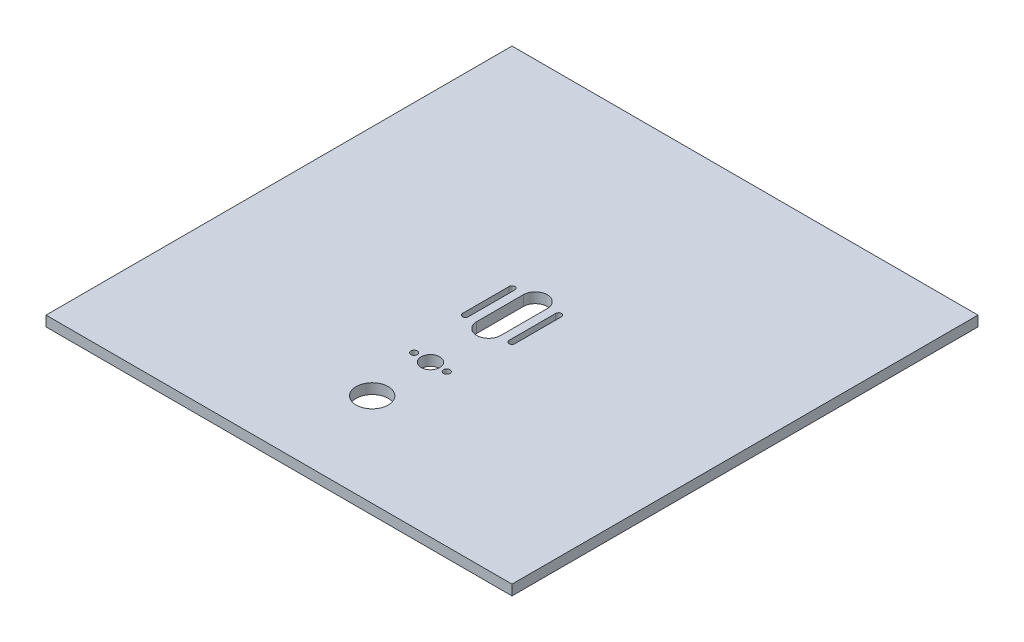
ISO-10303-21;
HEADER;
FILE_DESCRIPTION(('STEP AP214'),'2;1');
FILE_NAME('part.step','',(''),(''),'','','');
FILE_SCHEMA(('AUTOMOTIVE_DESIGN { 1 0 10303 214 1 1 1 1 }'));
ENDSEC;
DATA;
#1=APPLICATION_CONTEXT('core data for automotive mechanical design processes');
#2=APPLICATION_PROTOCOL_DEFINITION('international standard','automotive_design',2000,#1);
#3=PRODUCT_CONTEXT('',#1,'mechanical');
#4=PRODUCT('Part','Part','',(#3));
#5=PRODUCT_RELATED_PRODUCT_CATEGORY('part','',(#4));
#6=PRODUCT_DEFINITION_FORMATION('','',#4);
#7=PRODUCT_DEFINITION_CONTEXT('part definition',#1,'design');
#8=PRODUCT_DEFINITION('design','',#6,#7);
#9=PRODUCT_DEFINITION_SHAPE('','',#8);
#10=(LENGTH_UNIT() NAMED_UNIT(*) SI_UNIT(.MILLI.,.METRE.));
#11=(NAMED_UNIT(*) PLANE_ANGLE_UNIT() SI_UNIT($,.RADIAN.));
#12=(NAMED_UNIT(*) SI_UNIT($,.STERADIAN.) SOLID_ANGLE_UNIT());
#13=UNCERTAINTY_MEASURE_WITH_UNIT(LENGTH_MEASURE(1.E-05),#10,'distance_accuracy_value','');
#14=(GEOMETRIC_REPRESENTATION_CONTEXT(3) GLOBAL_UNCERTAINTY_ASSIGNED_CONTEXT((#13)) GLOBAL_UNIT_ASSIGNED_CONTEXT((#10,
#11,#12)) REPRESENTATION_CONTEXT('',''));
#15=CARTESIAN_POINT('',(0.,0.,0.));
#16=DIRECTION('',(0.,0.,1.));
#17=DIRECTION('',(1.,0.,0.));
#18=AXIS2_PLACEMENT_3D('',#15,#16,#17);
#19=CARTESIAN_POINT('',(127.,5.588,127.));
#20=DIRECTION('',(-1.,0.,0.));
#21=DIRECTION('',(0.,0.,1.));
#22=AXIS2_PLACEMENT_3D('',#19,#20,#21);
#23=PLANE('',#22);
#24=DIRECTION('',(0.,0.,-1.));
#25=VECTOR('',#24,1.);
#26=CARTESIAN_POINT('',(127.,0.,127.));
#27=LINE('',#26,#25);
#28=CARTESIAN_POINT('',(127.,0.,127.));
#29=VERTEX_POINT('',#28);
#30=CARTESIAN_POINT('',(127.,0.,-127.));
#31=VERTEX_POINT('',#30);
#32=EDGE_CURVE('E255',#29,#31,#27,.T.);
#33=ORIENTED_EDGE('',*,*,#32,.T.);
#34=DIRECTION('',(0.,-1.,0.));
#35=VECTOR('',#34,1.);
#36=CARTESIAN_POINT('',(127.,5.588,-127.));
#37=LINE('',#36,#35);
#38=CARTESIAN_POINT('',(127.,5.588,-127.));
#39=VERTEX_POINT('',#38);
#40=EDGE_CURVE('E11',#39,#31,#37,.T.);
#41=ORIENTED_EDGE('',*,*,#40,.F.);
#42=DIRECTION('',(0.,0.,-1.));
#43=VECTOR('',#42,1.);
#44=CARTESIAN_POINT('',(127.,5.588,127.));
#45=LINE('',#44,#43);
#46=CARTESIAN_POINT('',(127.,5.588,127.));
#47=VERTEX_POINT('',#46);
#48=EDGE_CURVE('E260',#47,#39,#45,.T.);
#49=ORIENTED_EDGE('',*,*,#48,.F.);
#50=DIRECTION('',(0.,-1.,0.));
#51=VECTOR('',#50,1.);
#52=CARTESIAN_POINT('',(127.,5.588,127.));
#53=LINE('',#52,#51);
#54=EDGE_CURVE('E270',#47,#29,#53,.T.);
#55=ORIENTED_EDGE('',*,*,#54,.T.);
#56=EDGE_LOOP('',(#33,#41,#49,#55));
#57=FACE_BOUND('',#56,.T.);
#58=ADVANCED_FACE('F35',(#57),#23,.F.);
#59=CARTESIAN_POINT('',(-127.,5.588,-127.));
#60=DIRECTION('',(0.,0.,1.));
#61=DIRECTION('',(1.,0.,0.));
#62=AXIS2_PLACEMENT_3D('',#59,#60,#61);
#63=PLANE('',#62);
#64=DIRECTION('',(-1.,0.,0.));
#65=VECTOR('',#64,1.);
#66=CARTESIAN_POINT('',(-127.,0.,-127.));
#67=LINE('',#66,#65);
#68=CARTESIAN_POINT('',(-127.,0.,-127.));
#69=VERTEX_POINT('',#68);
#70=EDGE_CURVE('E273',#31,#69,#67,.T.);
#71=ORIENTED_EDGE('',*,*,#70,.T.);
#72=DIRECTION('',(0.,-1.,0.));
#73=VECTOR('',#72,1.);
#74=CARTESIAN_POINT('',(-127.,5.588,-127.));
#75=LINE('',#74,#73);
#76=CARTESIAN_POINT('',(-127.,5.588,-127.));
#77=VERTEX_POINT('',#76);
#78=EDGE_CURVE('E42',#77,#69,#75,.T.);
#79=ORIENTED_EDGE('',*,*,#78,.F.);
#80=DIRECTION('',(-1.,0.,0.));
#81=VECTOR('',#80,1.);
#82=CARTESIAN_POINT('',(-127.,5.588,-127.));
#83=LINE('',#82,#81);
#84=EDGE_CURVE('E263',#39,#77,#83,.T.);
#85=ORIENTED_EDGE('',*,*,#84,.F.);
#86=ORIENTED_EDGE('',*,*,#40,.T.);
#87=EDGE_LOOP('',(#71,#79,#85,#86));
#88=FACE_BOUND('',#87,.T.);
#89=ADVANCED_FACE('F302',(#88),#63,.F.);
#90=CARTESIAN_POINT('',(-127.,5.588,127.));
#91=DIRECTION('',(1.,0.,0.));
#92=DIRECTION('',(0.,0.,-1.));
#93=AXIS2_PLACEMENT_3D('',#90,#91,#92);
#94=PLANE('',#93);
#95=DIRECTION('',(0.,0.,1.));
#96=VECTOR('',#95,1.);
#97=CARTESIAN_POINT('',(-127.,0.,127.));
#98=LINE('',#97,#96);
#99=CARTESIAN_POINT('',(-127.,0.,127.));
#100=VERTEX_POINT('',#99);
#101=EDGE_CURVE('E275',#69,#100,#98,.T.);
#102=ORIENTED_EDGE('',*,*,#101,.T.);
#103=DIRECTION('',(0.,-1.,0.));
#104=VECTOR('',#103,1.);
#105=CARTESIAN_POINT('',(-127.,5.588,127.));
#106=LINE('',#105,#104);
#107=CARTESIAN_POINT('',(-127.,5.588,127.));
#108=VERTEX_POINT('',#107);
#109=EDGE_CURVE('E280',#108,#100,#106,.T.);
#110=ORIENTED_EDGE('',*,*,#109,.F.);
#111=DIRECTION('',(0.,0.,1.));
#112=VECTOR('',#111,1.);
#113=CARTESIAN_POINT('',(-127.,5.588,127.));
#114=LINE('',#113,#112);
#115=EDGE_CURVE('E266',#77,#108,#114,.T.);
#116=ORIENTED_EDGE('',*,*,#115,.F.);
#117=ORIENTED_EDGE('',*,*,#78,.T.);
#118=EDGE_LOOP('',(#102,#110,#116,#117));
#119=FACE_BOUND('',#118,.T.);
#120=ADVANCED_FACE('F287',(#119),#94,.F.);
#121=CARTESIAN_POINT('',(-127.,5.588,127.));
#122=DIRECTION('',(0.,0.,-1.));
#123=DIRECTION('',(-1.,0.,0.));
#124=AXIS2_PLACEMENT_3D('',#121,#122,#123);
#125=PLANE('',#124);
#126=DIRECTION('',(1.,0.,0.));
#127=VECTOR('',#126,1.);
#128=CARTESIAN_POINT('',(-127.,0.,127.));
#129=LINE('',#128,#127);
#130=EDGE_CURVE('E264',#100,#29,#129,.T.);
#131=ORIENTED_EDGE('',*,*,#130,.T.);
#132=ORIENTED_EDGE('',*,*,#54,.F.);
#133=DIRECTION('',(1.,0.,0.));
#134=VECTOR('',#133,1.);
#135=CARTESIAN_POINT('',(-127.,5.588,127.));
#136=LINE('',#135,#134);
#137=EDGE_CURVE('E268',#108,#47,#136,.T.);
#138=ORIENTED_EDGE('',*,*,#137,.F.);
#139=ORIENTED_EDGE('',*,*,#109,.T.);
#140=EDGE_LOOP('',(#131,#132,#138,#139));
#141=FACE_BOUND('',#140,.T.);
#142=ADVANCED_FACE('F295',(#141),#125,.F.);
#143=CARTESIAN_POINT('',(0.,5.588,0.));
#144=DIRECTION('',(0.,-1.,0.));
#145=DIRECTION('',(0.,0.,-1.));
#146=AXIS2_PLACEMENT_3D('',#143,#144,#145);
#147=PLANE('',#146);
#148=CARTESIAN_POINT('',(8.89,5.588,44.45));
#149=DIRECTION('',(0.,1.,0.));
#150=DIRECTION('',(0.,0.,1.));
#151=AXIS2_PLACEMENT_3D('',#148,#149,#150);
#152=CIRCLE('',#151,1.778);
#153=CARTESIAN_POINT('',(8.89,5.588,46.228));
#154=VERTEX_POINT('',#153);
#155=EDGE_CURVE('E245',#154,#154,#152,.T.);
#156=ORIENTED_EDGE('',*,*,#155,.F.);
#157=EDGE_LOOP('',(#156));
#158=FACE_BOUND('',#157,.T.);
#159=CARTESIAN_POINT('',(-8.89,5.588,44.45));
#160=DIRECTION('',(0.,1.,0.));
#161=DIRECTION('',(0.,0.,1.));
#162=AXIS2_PLACEMENT_3D('',#159,#160,#161);
#163=CIRCLE('',#162,1.77799999999999);
#164=CARTESIAN_POINT('',(-8.89,5.588,46.228));
#165=VERTEX_POINT('',#164);
#166=EDGE_CURVE('E384',#165,#165,#163,.T.);
#167=ORIENTED_EDGE('',*,*,#166,.F.);
#168=EDGE_LOOP('',(#167));
#169=FACE_BOUND('',#168,.T.);
#170=CARTESIAN_POINT('',(0.,5.588,44.45));
#171=DIRECTION('',(0.,1.,0.));
#172=DIRECTION('',(0.,0.,1.));
#173=AXIS2_PLACEMENT_3D('',#170,#171,#172);
#174=CIRCLE('',#173,5.08000000000001);
#175=CARTESIAN_POINT('',(0.,5.588,49.53));
#176=VERTEX_POINT('',#175);
#177=EDGE_CURVE('E174',#176,#176,#174,.T.);
#178=ORIENTED_EDGE('',*,*,#177,.F.);
#179=EDGE_LOOP('',(#178));
#180=FACE_BOUND('',#179,.T.);
#181=DIRECTION('',(0.,0.,1.));
#182=VECTOR('',#181,1.);
#183=CARTESIAN_POINT('',(11.1125,5.588,-12.7));
#184=LINE('',#183,#182);
#185=CARTESIAN_POINT('',(11.1125,5.588,-12.7));
#186=VERTEX_POINT('',#185);
#187=CARTESIAN_POINT('',(11.1125,5.588,12.7));
#188=VERTEX_POINT('',#187);
#189=EDGE_CURVE('E206',#186,#188,#184,.T.);
#190=ORIENTED_EDGE('',*,*,#189,.F.);
#191=CARTESIAN_POINT('',(12.7,5.588,-12.7));
#192=DIRECTION('',(0.,1.,0.));
#193=DIRECTION('',(0.,0.,1.));
#194=AXIS2_PLACEMENT_3D('',#191,#192,#193);
#195=CIRCLE('',#194,1.5875);
#196=CARTESIAN_POINT('',(14.2875,5.588,-12.7));
#197=VERTEX_POINT('',#196);
#198=EDGE_CURVE('E49',#197,#186,#195,.T.);
#199=ORIENTED_EDGE('',*,*,#198,.F.);
#200=DIRECTION('',(0.,0.,-1.));
#201=VECTOR('',#200,1.);
#202=CARTESIAN_POINT('',(14.2875,5.588,-12.7));
#203=LINE('',#202,#201);
#204=CARTESIAN_POINT('',(14.2875,5.588,12.7));
#205=VERTEX_POINT('',#204);
#206=EDGE_CURVE('E195',#205,#197,#203,.T.);
#207=ORIENTED_EDGE('',*,*,#206,.F.);
#208=CARTESIAN_POINT('',(12.7,5.588,12.7));
#209=DIRECTION('',(0.,1.,0.));
#210=DIRECTION('',(0.,0.,1.));
#211=AXIS2_PLACEMENT_3D('',#208,#209,#210);
#212=CIRCLE('',#211,1.5875);
#213=EDGE_CURVE('E209',#188,#205,#212,.T.);
#214=ORIENTED_EDGE('',*,*,#213,.F.);
#215=EDGE_LOOP('',(#190,#199,#207,#214));
#216=FACE_BOUND('',#215,.T.);
#217=DIRECTION('',(0.,0.,1.));
#218=VECTOR('',#217,1.);
#219=CARTESIAN_POINT('',(-14.2875,5.588,-12.7));
#220=LINE('',#219,#218);
#221=CARTESIAN_POINT('',(-14.2875,5.588,-12.7));
#222=VERTEX_POINT('',#221);
#223=CARTESIAN_POINT('',(-14.2875,5.588,12.7));
#224=VERTEX_POINT('',#223);
#225=EDGE_CURVE('E180',#222,#224,#220,.T.);
#226=ORIENTED_EDGE('',*,*,#225,.F.);
#227=CARTESIAN_POINT('',(-12.7,5.588,-12.7));
#228=DIRECTION('',(0.,1.,0.));
#229=DIRECTION('',(0.,0.,1.));
#230=AXIS2_PLACEMENT_3D('',#227,#228,#229);
#231=CIRCLE('',#230,1.5875);
#232=CARTESIAN_POINT('',(-11.1125,5.588,-12.7));
#233=VERTEX_POINT('',#232);
#234=EDGE_CURVE('E57',#233,#222,#231,.T.);
#235=ORIENTED_EDGE('',*,*,#234,.F.);
#236=DIRECTION('',(0.,0.,-1.));
#237=VECTOR('',#236,1.);
#238=CARTESIAN_POINT('',(-11.1125,5.588,-12.7));
#239=LINE('',#238,#237);
#240=CARTESIAN_POINT('',(-11.1125,5.588,12.7));
#241=VERTEX_POINT('',#240);
#242=EDGE_CURVE('E168',#241,#233,#239,.T.);
#243=ORIENTED_EDGE('',*,*,#242,.F.);
#244=CARTESIAN_POINT('',(-12.7,5.588,12.7));
#245=DIRECTION('',(0.,1.,0.));
#246=DIRECTION('',(0.,0.,1.));
#247=AXIS2_PLACEMENT_3D('',#244,#245,#246);
#248=CIRCLE('',#247,1.5875);
#249=EDGE_CURVE('E171',#224,#241,#248,.T.);
#250=ORIENTED_EDGE('',*,*,#249,.F.);
#251=EDGE_LOOP('',(#226,#235,#243,#250));
#252=FACE_BOUND('',#251,.T.);
#253=DIRECTION('',(0.,0.,1.));
#254=VECTOR('',#253,1.);
#255=CARTESIAN_POINT('',(-6.54049999999997,5.588,-12.7));
#256=LINE('',#255,#254);
#257=CARTESIAN_POINT('',(-6.54049999999997,5.588,-12.7));
#258=VERTEX_POINT('',#257);
#259=CARTESIAN_POINT('',(-6.54049999999999,5.588,12.7));
#260=VERTEX_POINT('',#259);
#261=EDGE_CURVE('E235',#258,#260,#256,.T.);
#262=ORIENTED_EDGE('',*,*,#261,.F.);
#263=CARTESIAN_POINT('',(0.,5.588,-12.7));
#264=DIRECTION('',(0.,1.,0.));
#265=DIRECTION('',(0.,0.,1.));
#266=AXIS2_PLACEMENT_3D('',#263,#264,#265);
#267=CIRCLE('',#266,6.54049999999998);
#268=CARTESIAN_POINT('',(6.54049999999999,5.588,-12.7));
#269=VERTEX_POINT('',#268);
#270=EDGE_CURVE('E187',#269,#258,#267,.T.);
#271=ORIENTED_EDGE('',*,*,#270,.F.);
#272=DIRECTION('',(0.,0.,-1.));
#273=VECTOR('',#272,1.);
#274=CARTESIAN_POINT('',(6.54049999999999,5.588,-12.7));
#275=LINE('',#274,#273);
#276=CARTESIAN_POINT('',(6.5405,5.588,12.7));
#277=VERTEX_POINT('',#276);
#278=EDGE_CURVE('E224',#277,#269,#275,.T.);
#279=ORIENTED_EDGE('',*,*,#278,.F.);
#280=CARTESIAN_POINT('',(0.,5.588,12.7));
#281=DIRECTION('',(0.,1.,0.));
#282=DIRECTION('',(0.,0.,1.));
#283=AXIS2_PLACEMENT_3D('',#280,#281,#282);
#284=CIRCLE('',#283,6.54049999999999);
#285=EDGE_CURVE('E238',#260,#277,#284,.T.);
#286=ORIENTED_EDGE('',*,*,#285,.F.);
#287=EDGE_LOOP('',(#262,#271,#279,#286));
#288=FACE_BOUND('',#287,.T.);
#289=CARTESIAN_POINT('',(0.,5.588,76.2));
#290=DIRECTION('',(0.,1.,0.));
#291=DIRECTION('',(0.,0.,1.));
#292=AXIS2_PLACEMENT_3D('',#289,#290,#291);
#293=CIRCLE('',#292,8.73125);
#294=CARTESIAN_POINT('',(0.,5.588,84.93125));
#295=VERTEX_POINT('',#294);
#296=EDGE_CURVE('E256',#295,#295,#293,.T.);
#297=ORIENTED_EDGE('',*,*,#296,.F.);
#298=EDGE_LOOP('',(#297));
#299=FACE_BOUND('',#298,.T.);
#300=ORIENTED_EDGE('',*,*,#48,.T.);
#301=ORIENTED_EDGE('',*,*,#84,.T.);
#302=ORIENTED_EDGE('',*,*,#115,.T.);
#303=ORIENTED_EDGE('',*,*,#137,.T.);
#304=EDGE_LOOP('',(#300,#301,#302,#303));
#305=FACE_BOUND('',#304,.T.);
#306=ADVANCED_FACE('F301',(#158,#169,#180,#216,#252,#288,#299,#305),#147,.F.);
#307=CARTESIAN_POINT('',(0.,0.,0.));
#308=DIRECTION('',(0.,-1.,0.));
#309=DIRECTION('',(0.,0.,-1.));
#310=AXIS2_PLACEMENT_3D('',#307,#308,#309);
#311=PLANE('',#310);
#312=CARTESIAN_POINT('',(8.89,0.,44.45));
#313=DIRECTION('',(0.,1.,0.));
#314=DIRECTION('',(0.,0.,1.));
#315=AXIS2_PLACEMENT_3D('',#312,#313,#314);
#316=CIRCLE('',#315,1.778);
#317=CARTESIAN_POINT('',(8.89,0.,46.228));
#318=VERTEX_POINT('',#317);
#319=EDGE_CURVE('E386',#318,#318,#316,.T.);
#320=ORIENTED_EDGE('',*,*,#319,.T.);
#321=EDGE_LOOP('',(#320));
#322=FACE_BOUND('',#321,.T.);
#323=CARTESIAN_POINT('',(-8.89,0.,44.45));
#324=DIRECTION('',(0.,1.,0.));
#325=DIRECTION('',(0.,0.,1.));
#326=AXIS2_PLACEMENT_3D('',#323,#324,#325);
#327=CIRCLE('',#326,1.77799999999999);
#328=CARTESIAN_POINT('',(-8.89,0.,46.228));
#329=VERTEX_POINT('',#328);
#330=EDGE_CURVE('E381',#329,#329,#327,.T.);
#331=ORIENTED_EDGE('',*,*,#330,.T.);
#332=EDGE_LOOP('',(#331));
#333=FACE_BOUND('',#332,.T.);
#334=CARTESIAN_POINT('',(0.,0.,44.45));
#335=DIRECTION('',(0.,1.,0.));
#336=DIRECTION('',(0.,0.,1.));
#337=AXIS2_PLACEMENT_3D('',#334,#335,#336);
#338=CIRCLE('',#337,5.08000000000001);
#339=CARTESIAN_POINT('',(0.,0.,49.53));
#340=VERTEX_POINT('',#339);
#341=EDGE_CURVE('E259',#340,#340,#338,.T.);
#342=ORIENTED_EDGE('',*,*,#341,.T.);
#343=EDGE_LOOP('',(#342));
#344=FACE_BOUND('',#343,.T.);
#345=CARTESIAN_POINT('',(12.7,0.,-12.7));
#346=DIRECTION('',(0.,1.,0.));
#347=DIRECTION('',(0.,0.,1.));
#348=AXIS2_PLACEMENT_3D('',#345,#346,#347);
#349=CIRCLE('',#348,1.5875);
#350=CARTESIAN_POINT('',(14.2875,0.,-12.7));
#351=VERTEX_POINT('',#350);
#352=CARTESIAN_POINT('',(11.1125,0.,-12.7));
#353=VERTEX_POINT('',#352);
#354=EDGE_CURVE('E191',#351,#353,#349,.T.);
#355=ORIENTED_EDGE('',*,*,#354,.T.);
#356=DIRECTION('',(0.,0.,1.));
#357=VECTOR('',#356,1.);
#358=CARTESIAN_POINT('',(11.1125,0.,-12.7));
#359=LINE('',#358,#357);
#360=CARTESIAN_POINT('',(11.1125,0.,12.7));
#361=VERTEX_POINT('',#360);
#362=EDGE_CURVE('E194',#353,#361,#359,.T.);
#363=ORIENTED_EDGE('',*,*,#362,.T.);
#364=CARTESIAN_POINT('',(12.7,0.,12.7));
#365=DIRECTION('',(0.,1.,0.));
#366=DIRECTION('',(0.,0.,1.));
#367=AXIS2_PLACEMENT_3D('',#364,#365,#366);
#368=CIRCLE('',#367,1.5875);
#369=CARTESIAN_POINT('',(14.2875,0.,12.7));
#370=VERTEX_POINT('',#369);
#371=EDGE_CURVE('E198',#361,#370,#368,.T.);
#372=ORIENTED_EDGE('',*,*,#371,.T.);
#373=DIRECTION('',(0.,0.,-1.));
#374=VECTOR('',#373,1.);
#375=CARTESIAN_POINT('',(14.2875,0.,-12.7));
#376=LINE('',#375,#374);
#377=EDGE_CURVE('E201',#370,#351,#376,.T.);
#378=ORIENTED_EDGE('',*,*,#377,.T.);
#379=EDGE_LOOP('',(#355,#363,#372,#378));
#380=FACE_BOUND('',#379,.T.);
#381=CARTESIAN_POINT('',(-12.7,0.,-12.7));
#382=DIRECTION('',(0.,1.,0.));
#383=DIRECTION('',(0.,0.,1.));
#384=AXIS2_PLACEMENT_3D('',#381,#382,#383);
#385=CIRCLE('',#384,1.5875);
#386=CARTESIAN_POINT('',(-11.1125,0.,-12.7));
#387=VERTEX_POINT('',#386);
#388=CARTESIAN_POINT('',(-14.2875,0.,-12.7));
#389=VERTEX_POINT('',#388);
#390=EDGE_CURVE('E149',#387,#389,#385,.T.);
#391=ORIENTED_EDGE('',*,*,#390,.T.);
#392=DIRECTION('',(0.,0.,1.));
#393=VECTOR('',#392,1.);
#394=CARTESIAN_POINT('',(-14.2875,0.,-12.7));
#395=LINE('',#394,#393);
#396=CARTESIAN_POINT('',(-14.2875,0.,12.7));
#397=VERTEX_POINT('',#396);
#398=EDGE_CURVE('E159',#389,#397,#395,.T.);
#399=ORIENTED_EDGE('',*,*,#398,.T.);
#400=CARTESIAN_POINT('',(-12.7,0.,12.7));
#401=DIRECTION('',(0.,1.,0.));
#402=DIRECTION('',(0.,0.,1.));
#403=AXIS2_PLACEMENT_3D('',#400,#401,#402);
#404=CIRCLE('',#403,1.5875);
#405=CARTESIAN_POINT('',(-11.1125,0.,12.7));
#406=VERTEX_POINT('',#405);
#407=EDGE_CURVE('E163',#397,#406,#404,.T.);
#408=ORIENTED_EDGE('',*,*,#407,.T.);
#409=DIRECTION('',(0.,0.,-1.));
#410=VECTOR('',#409,1.);
#411=CARTESIAN_POINT('',(-11.1125,0.,-12.7));
#412=LINE('',#411,#410);
#413=EDGE_CURVE('E155',#406,#387,#412,.T.);
#414=ORIENTED_EDGE('',*,*,#413,.T.);
#415=EDGE_LOOP('',(#391,#399,#408,#414));
#416=FACE_BOUND('',#415,.T.);
#417=CARTESIAN_POINT('',(0.,0.,-12.7));
#418=DIRECTION('',(0.,1.,0.));
#419=DIRECTION('',(0.,0.,1.));
#420=AXIS2_PLACEMENT_3D('',#417,#418,#419);
#421=CIRCLE('',#420,6.54049999999998);
#422=CARTESIAN_POINT('',(6.54049999999999,0.,-12.7));
#423=VERTEX_POINT('',#422);
#424=CARTESIAN_POINT('',(-6.54049999999997,0.,-12.7));
#425=VERTEX_POINT('',#424);
#426=EDGE_CURVE('E220',#423,#425,#421,.T.);
#427=ORIENTED_EDGE('',*,*,#426,.T.);
#428=DIRECTION('',(0.,0.,1.));
#429=VECTOR('',#428,1.);
#430=CARTESIAN_POINT('',(-6.54049999999997,0.,-12.7));
#431=LINE('',#430,#429);
#432=CARTESIAN_POINT('',(-6.54049999999998,0.,12.7));
#433=VERTEX_POINT('',#432);
#434=EDGE_CURVE('E223',#425,#433,#431,.T.);
#435=ORIENTED_EDGE('',*,*,#434,.T.);
#436=CARTESIAN_POINT('',(0.,0.,12.7));
#437=DIRECTION('',(0.,1.,0.));
#438=DIRECTION('',(0.,0.,1.));
#439=AXIS2_PLACEMENT_3D('',#436,#437,#438);
#440=CIRCLE('',#439,6.54049999999999);
#441=CARTESIAN_POINT('',(6.5405,0.,12.7));
#442=VERTEX_POINT('',#441);
#443=EDGE_CURVE('E227',#433,#442,#440,.T.);
#444=ORIENTED_EDGE('',*,*,#443,.T.);
#445=DIRECTION('',(0.,0.,-1.));
#446=VECTOR('',#445,1.);
#447=CARTESIAN_POINT('',(6.54049999999999,0.,-12.7));
#448=LINE('',#447,#446);
#449=EDGE_CURVE('E230',#442,#423,#448,.T.);
#450=ORIENTED_EDGE('',*,*,#449,.T.);
#451=EDGE_LOOP('',(#427,#435,#444,#450));
#452=FACE_BOUND('',#451,.T.);
#453=CARTESIAN_POINT('',(0.,0.,76.2));
#454=DIRECTION('',(0.,1.,0.));
#455=DIRECTION('',(0.,0.,1.));
#456=AXIS2_PLACEMENT_3D('',#453,#454,#455);
#457=CIRCLE('',#456,8.73125);
#458=CARTESIAN_POINT('',(0.,0.,84.93125));
#459=VERTEX_POINT('',#458);
#460=EDGE_CURVE('E252',#459,#459,#457,.T.);
#461=ORIENTED_EDGE('',*,*,#460,.T.);
#462=EDGE_LOOP('',(#461));
#463=FACE_BOUND('',#462,.T.);
#464=ORIENTED_EDGE('',*,*,#32,.F.);
#465=ORIENTED_EDGE('',*,*,#130,.F.);
#466=ORIENTED_EDGE('',*,*,#101,.F.);
#467=ORIENTED_EDGE('',*,*,#70,.F.);
#468=EDGE_LOOP('',(#464,#465,#466,#467));
#469=FACE_BOUND('',#468,.T.);
#470=ADVANCED_FACE('F165',(#322,#333,#344,#380,#416,#452,#463,#469),#311,.T.);
#471=CARTESIAN_POINT('',(0.,0.,76.2));
#472=DIRECTION('',(0.,1.,0.));
#473=DIRECTION('',(0.,0.,1.));
#474=AXIS2_PLACEMENT_3D('',#471,#472,#473);
#475=CYLINDRICAL_SURFACE('',#474,8.73125);
#476=ORIENTED_EDGE('',*,*,#460,.F.);
#477=EDGE_LOOP('',(#476));
#478=FACE_BOUND('',#477,.T.);
#479=ORIENTED_EDGE('',*,*,#296,.T.);
#480=EDGE_LOOP('',(#479));
#481=FACE_BOUND('',#480,.T.);
#482=ADVANCED_FACE('F314',(#478,#481),#475,.F.);
#483=CARTESIAN_POINT('',(0.,0.,-12.7));
#484=DIRECTION('',(0.,1.,0.));
#485=DIRECTION('',(0.,0.,1.));
#486=AXIS2_PLACEMENT_3D('',#483,#484,#485);
#487=CYLINDRICAL_SURFACE('',#486,6.54049999999998);
#488=ORIENTED_EDGE('',*,*,#270,.T.);
#489=DIRECTION('',(0.,1.,0.));
#490=VECTOR('',#489,1.);
#491=CARTESIAN_POINT('',(-6.54049999999997,0.,-12.7));
#492=LINE('',#491,#490);
#493=EDGE_CURVE('E233',#425,#258,#492,.T.);
#494=ORIENTED_EDGE('',*,*,#493,.F.);
#495=ORIENTED_EDGE('',*,*,#426,.F.);
#496=DIRECTION('',(0.,1.,0.));
#497=VECTOR('',#496,1.);
#498=CARTESIAN_POINT('',(6.54049999999999,0.,-12.7));
#499=LINE('',#498,#497);
#500=EDGE_CURVE('E243',#423,#269,#499,.T.);
#501=ORIENTED_EDGE('',*,*,#500,.T.);
#502=EDGE_LOOP('',(#488,#494,#495,#501));
#503=FACE_BOUND('',#502,.T.);
#504=ADVANCED_FACE('F321',(#503),#487,.F.);
#505=CARTESIAN_POINT('',(6.54049999999999,0.,-12.7));
#506=DIRECTION('',(1.,0.,0.));
#507=DIRECTION('',(0.,0.,-1.));
#508=AXIS2_PLACEMENT_3D('',#505,#506,#507);
#509=PLANE('',#508);
#510=ORIENTED_EDGE('',*,*,#278,.T.);
#511=ORIENTED_EDGE('',*,*,#500,.F.);
#512=ORIENTED_EDGE('',*,*,#449,.F.);
#513=DIRECTION('',(0.,1.,0.));
#514=VECTOR('',#513,1.);
#515=CARTESIAN_POINT('',(6.5405,0.,12.7));
#516=LINE('',#515,#514);
#517=EDGE_CURVE('E246',#442,#277,#516,.T.);
#518=ORIENTED_EDGE('',*,*,#517,.T.);
#519=EDGE_LOOP('',(#510,#511,#512,#518));
#520=FACE_BOUND('',#519,.T.);
#521=ADVANCED_FACE('F325',(#520),#509,.F.);
#522=CARTESIAN_POINT('',(0.,0.,12.7));
#523=DIRECTION('',(0.,1.,0.));
#524=DIRECTION('',(0.,0.,1.));
#525=AXIS2_PLACEMENT_3D('',#522,#523,#524);
#526=CYLINDRICAL_SURFACE('',#525,6.54049999999999);
#527=ORIENTED_EDGE('',*,*,#285,.T.);
#528=ORIENTED_EDGE('',*,*,#517,.F.);
#529=ORIENTED_EDGE('',*,*,#443,.F.);
#530=DIRECTION('',(0.,1.,0.));
#531=VECTOR('',#530,1.);
#532=CARTESIAN_POINT('',(-6.54049999999999,0.,12.7));
#533=LINE('',#532,#531);
#534=EDGE_CURVE('E248',#433,#260,#533,.T.);
#535=ORIENTED_EDGE('',*,*,#534,.T.);
#536=EDGE_LOOP('',(#527,#528,#529,#535));
#537=FACE_BOUND('',#536,.T.);
#538=ADVANCED_FACE('F330',(#537),#526,.F.);
#539=CARTESIAN_POINT('',(-6.54049999999997,0.,-12.7));
#540=DIRECTION('',(-1.,0.,0.));
#541=DIRECTION('',(0.,0.,1.));
#542=AXIS2_PLACEMENT_3D('',#539,#540,#541);
#543=PLANE('',#542);
#544=ORIENTED_EDGE('',*,*,#261,.T.);
#545=ORIENTED_EDGE('',*,*,#534,.F.);
#546=ORIENTED_EDGE('',*,*,#434,.F.);
#547=ORIENTED_EDGE('',*,*,#493,.T.);
#548=EDGE_LOOP('',(#544,#545,#546,#547));
#549=FACE_BOUND('',#548,.T.);
#550=ADVANCED_FACE('F327',(#549),#543,.F.);
#551=CARTESIAN_POINT('',(-12.7,0.,-12.7));
#552=DIRECTION('',(0.,1.,0.));
#553=DIRECTION('',(0.,0.,1.));
#554=AXIS2_PLACEMENT_3D('',#551,#552,#553);
#555=CYLINDRICAL_SURFACE('',#554,1.5875);
#556=ORIENTED_EDGE('',*,*,#234,.T.);
#557=DIRECTION('',(0.,1.,0.));
#558=VECTOR('',#557,1.);
#559=CARTESIAN_POINT('',(-14.2875,0.,-12.7));
#560=LINE('',#559,#558);
#561=EDGE_CURVE('E145',#389,#222,#560,.T.);
#562=ORIENTED_EDGE('',*,*,#561,.F.);
#563=ORIENTED_EDGE('',*,*,#390,.F.);
#564=DIRECTION('',(0.,1.,0.));
#565=VECTOR('',#564,1.);
#566=CARTESIAN_POINT('',(-11.1125,0.,-12.7));
#567=LINE('',#566,#565);
#568=EDGE_CURVE('E185',#387,#233,#567,.T.);
#569=ORIENTED_EDGE('',*,*,#568,.T.);
#570=EDGE_LOOP('',(#556,#562,#563,#569));
#571=FACE_BOUND('',#570,.T.);
#572=ADVANCED_FACE('F147',(#571),#555,.F.);
#573=CARTESIAN_POINT('',(-11.1125,0.,-12.7));
#574=DIRECTION('',(1.,0.,0.));
#575=DIRECTION('',(0.,0.,-1.));
#576=AXIS2_PLACEMENT_3D('',#573,#574,#575);
#577=PLANE('',#576);
#578=ORIENTED_EDGE('',*,*,#242,.T.);
#579=ORIENTED_EDGE('',*,*,#568,.F.);
#580=ORIENTED_EDGE('',*,*,#413,.F.);
#581=DIRECTION('',(0.,1.,0.));
#582=VECTOR('',#581,1.);
#583=CARTESIAN_POINT('',(-11.1125,0.,12.7));
#584=LINE('',#583,#582);
#585=EDGE_CURVE('E188',#406,#241,#584,.T.);
#586=ORIENTED_EDGE('',*,*,#585,.T.);
#587=EDGE_LOOP('',(#578,#579,#580,#586));
#588=FACE_BOUND('',#587,.T.);
#589=ADVANCED_FACE('F356',(#588),#577,.F.);
#590=CARTESIAN_POINT('',(-12.7,0.,12.7));
#591=DIRECTION('',(0.,1.,0.));
#592=DIRECTION('',(0.,0.,1.));
#593=AXIS2_PLACEMENT_3D('',#590,#591,#592);
#594=CYLINDRICAL_SURFACE('',#593,1.5875);
#595=ORIENTED_EDGE('',*,*,#249,.T.);
#596=ORIENTED_EDGE('',*,*,#585,.F.);
#597=ORIENTED_EDGE('',*,*,#407,.F.);
#598=DIRECTION('',(0.,1.,0.));
#599=VECTOR('',#598,1.);
#600=CARTESIAN_POINT('',(-14.2875,0.,12.7));
#601=LINE('',#600,#599);
#602=EDGE_CURVE('E154',#397,#224,#601,.T.);
#603=ORIENTED_EDGE('',*,*,#602,.T.);
#604=EDGE_LOOP('',(#595,#596,#597,#603));
#605=FACE_BOUND('',#604,.T.);
#606=ADVANCED_FACE('F359',(#605),#594,.F.);
#607=CARTESIAN_POINT('',(-14.2875,0.,-12.7));
#608=DIRECTION('',(-1.,0.,0.));
#609=DIRECTION('',(0.,0.,1.));
#610=AXIS2_PLACEMENT_3D('',#607,#608,#609);
#611=PLANE('',#610);
#612=ORIENTED_EDGE('',*,*,#225,.T.);
#613=ORIENTED_EDGE('',*,*,#602,.F.);
#614=ORIENTED_EDGE('',*,*,#398,.F.);
#615=ORIENTED_EDGE('',*,*,#561,.T.);
#616=EDGE_LOOP('',(#612,#613,#614,#615));
#617=FACE_BOUND('',#616,.T.);
#618=ADVANCED_FACE('F160',(#617),#611,.F.);
#619=CARTESIAN_POINT('',(12.7,0.,-12.7));
#620=DIRECTION('',(0.,1.,0.));
#621=DIRECTION('',(0.,0.,1.));
#622=AXIS2_PLACEMENT_3D('',#619,#620,#621);
#623=CYLINDRICAL_SURFACE('',#622,1.5875);
#624=ORIENTED_EDGE('',*,*,#198,.T.);
#625=DIRECTION('',(0.,1.,0.));
#626=VECTOR('',#625,1.);
#627=CARTESIAN_POINT('',(11.1125,0.,-12.7));
#628=LINE('',#627,#626);
#629=EDGE_CURVE('E204',#353,#186,#628,.T.);
#630=ORIENTED_EDGE('',*,*,#629,.F.);
#631=ORIENTED_EDGE('',*,*,#354,.F.);
#632=DIRECTION('',(0.,1.,0.));
#633=VECTOR('',#632,1.);
#634=CARTESIAN_POINT('',(14.2875,0.,-12.7));
#635=LINE('',#634,#633);
#636=EDGE_CURVE('E181',#351,#197,#635,.T.);
#637=ORIENTED_EDGE('',*,*,#636,.T.);
#638=EDGE_LOOP('',(#624,#630,#631,#637));
#639=FACE_BOUND('',#638,.T.);
#640=ADVANCED_FACE('F338',(#639),#623,.F.);
#641=CARTESIAN_POINT('',(14.2875,0.,-12.7));
#642=DIRECTION('',(1.,0.,0.));
#643=DIRECTION('',(0.,0.,-1.));
#644=AXIS2_PLACEMENT_3D('',#641,#642,#643);
#645=PLANE('',#644);
#646=ORIENTED_EDGE('',*,*,#206,.T.);
#647=ORIENTED_EDGE('',*,*,#636,.F.);
#648=ORIENTED_EDGE('',*,*,#377,.F.);
#649=DIRECTION('',(0.,1.,0.));
#650=VECTOR('',#649,1.);
#651=CARTESIAN_POINT('',(14.2875,0.,12.7));
#652=LINE('',#651,#650);
#653=EDGE_CURVE('E215',#370,#205,#652,.T.);
#654=ORIENTED_EDGE('',*,*,#653,.T.);
#655=EDGE_LOOP('',(#646,#647,#648,#654));
#656=FACE_BOUND('',#655,.T.);
#657=ADVANCED_FACE('F341',(#656),#645,.F.);
#658=CARTESIAN_POINT('',(12.7,0.,12.7));
#659=DIRECTION('',(0.,1.,0.));
#660=DIRECTION('',(0.,0.,1.));
#661=AXIS2_PLACEMENT_3D('',#658,#659,#660);
#662=CYLINDRICAL_SURFACE('',#661,1.5875);
#663=ORIENTED_EDGE('',*,*,#213,.T.);
#664=ORIENTED_EDGE('',*,*,#653,.F.);
#665=ORIENTED_EDGE('',*,*,#371,.F.);
#666=DIRECTION('',(0.,1.,0.));
#667=VECTOR('',#666,1.);
#668=CARTESIAN_POINT('',(11.1125,0.,12.7));
#669=LINE('',#668,#667);
#670=EDGE_CURVE('E217',#361,#188,#669,.T.);
#671=ORIENTED_EDGE('',*,*,#670,.T.);
#672=EDGE_LOOP('',(#663,#664,#665,#671));
#673=FACE_BOUND('',#672,.T.);
#674=ADVANCED_FACE('F346',(#673),#662,.F.);
#675=CARTESIAN_POINT('',(11.1125,0.,-12.7));
#676=DIRECTION('',(-1.,0.,0.));
#677=DIRECTION('',(0.,0.,1.));
#678=AXIS2_PLACEMENT_3D('',#675,#676,#677);
#679=PLANE('',#678);
#680=ORIENTED_EDGE('',*,*,#189,.T.);
#681=ORIENTED_EDGE('',*,*,#670,.F.);
#682=ORIENTED_EDGE('',*,*,#362,.F.);
#683=ORIENTED_EDGE('',*,*,#629,.T.);
#684=EDGE_LOOP('',(#680,#681,#682,#683));
#685=FACE_BOUND('',#684,.T.);
#686=ADVANCED_FACE('F342',(#685),#679,.F.);
#687=CARTESIAN_POINT('',(0.,0.,44.45));
#688=DIRECTION('',(0.,1.,0.));
#689=DIRECTION('',(0.,0.,1.));
#690=AXIS2_PLACEMENT_3D('',#687,#688,#689);
#691=CYLINDRICAL_SURFACE('',#690,5.08000000000001);
#692=ORIENTED_EDGE('',*,*,#341,.F.);
#693=EDGE_LOOP('',(#692));
#694=FACE_BOUND('',#693,.T.);
#695=ORIENTED_EDGE('',*,*,#177,.T.);
#696=EDGE_LOOP('',(#695));
#697=FACE_BOUND('',#696,.T.);
#698=ADVANCED_FACE('F345',(#694,#697),#691,.F.);
#699=CARTESIAN_POINT('',(-8.89,0.,44.45));
#700=DIRECTION('',(0.,1.,0.));
#701=DIRECTION('',(0.,0.,1.));
#702=AXIS2_PLACEMENT_3D('',#699,#700,#701);
#703=CYLINDRICAL_SURFACE('',#702,1.77799999999999);
#704=ORIENTED_EDGE('',*,*,#330,.F.);
#705=EDGE_LOOP('',(#704));
#706=FACE_BOUND('',#705,.T.);
#707=ORIENTED_EDGE('',*,*,#166,.T.);
#708=EDGE_LOOP('',(#707));
#709=FACE_BOUND('',#708,.T.);
#710=ADVANCED_FACE('F368',(#706,#709),#703,.F.);
#711=CARTESIAN_POINT('',(8.89,0.,44.45));
#712=DIRECTION('',(0.,1.,0.));
#713=DIRECTION('',(0.,0.,1.));
#714=AXIS2_PLACEMENT_3D('',#711,#712,#713);
#715=CYLINDRICAL_SURFACE('',#714,1.778);
#716=ORIENTED_EDGE('',*,*,#319,.F.);
#717=EDGE_LOOP('',(#716));
#718=FACE_BOUND('',#717,.T.);
#719=ORIENTED_EDGE('',*,*,#155,.T.);
#720=EDGE_LOOP('',(#719));
#721=FACE_BOUND('',#720,.T.);
#722=ADVANCED_FACE('F370',(#718,#721),#715,.F.);
#723=CLOSED_SHELL('',(#58,#89,#120,#142,#306,#470,#482,#504,#521,#538,#550,#572,#589,#606,#618,
#640,#657,#674,#686,#698,#710,#722));
#724=MANIFOLD_SOLID_BREP('B2',#723);
#725=ADVANCED_BREP_SHAPE_REPRESENTATION('',(#18,#724),#14);
#726=SHAPE_DEFINITION_REPRESENTATION(#9,#725);
ENDSEC;
END-ISO-10303-21;
